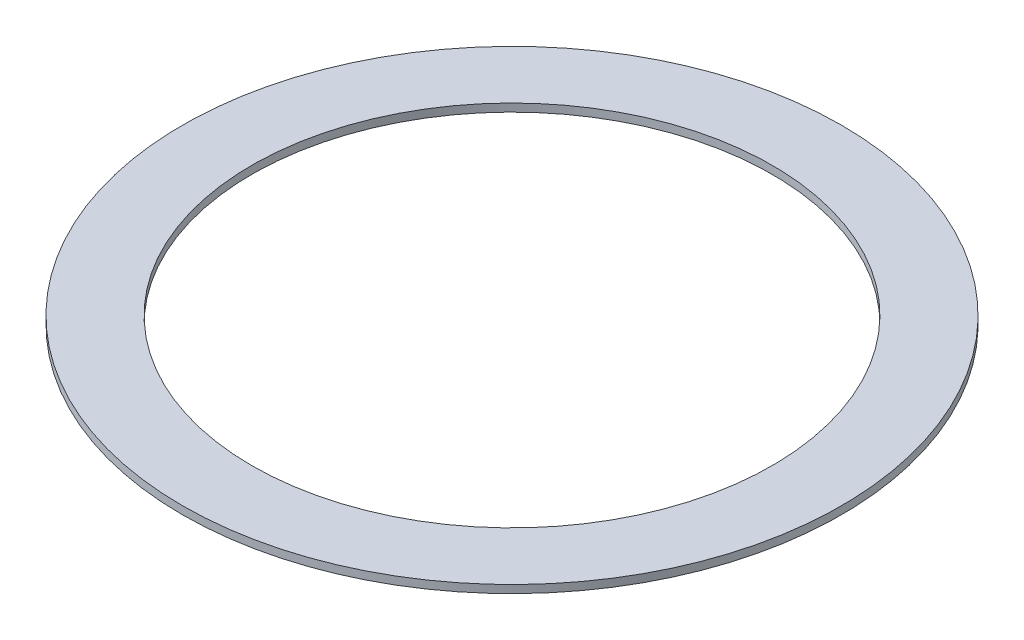
ISO-10303-21;
HEADER;
FILE_DESCRIPTION(('STEP AP214'),'2;1');
FILE_NAME('part.step','',(''),(''),'','','');
FILE_SCHEMA(('AUTOMOTIVE_DESIGN { 1 0 10303 214 1 1 1 1 }'));
ENDSEC;
DATA;
#1=APPLICATION_CONTEXT('core data for automotive mechanical design processes');
#2=APPLICATION_PROTOCOL_DEFINITION('international standard','automotive_design',2000,#1);
#3=PRODUCT_CONTEXT('',#1,'mechanical');
#4=PRODUCT('Part','Part','',(#3));
#5=PRODUCT_RELATED_PRODUCT_CATEGORY('part','',(#4));
#6=PRODUCT_DEFINITION_FORMATION('','',#4);
#7=PRODUCT_DEFINITION_CONTEXT('part definition',#1,'design');
#8=PRODUCT_DEFINITION('design','',#6,#7);
#9=PRODUCT_DEFINITION_SHAPE('','',#8);
#10=(LENGTH_UNIT() NAMED_UNIT(*) SI_UNIT(.MILLI.,.METRE.));
#11=(NAMED_UNIT(*) PLANE_ANGLE_UNIT() SI_UNIT($,.RADIAN.));
#12=(NAMED_UNIT(*) SI_UNIT($,.STERADIAN.) SOLID_ANGLE_UNIT());
#13=UNCERTAINTY_MEASURE_WITH_UNIT(LENGTH_MEASURE(1.E-05),#10,'distance_accuracy_value','');
#14=(GEOMETRIC_REPRESENTATION_CONTEXT(3) GLOBAL_UNCERTAINTY_ASSIGNED_CONTEXT((#13)) GLOBAL_UNIT_ASSIGNED_CONTEXT((#10,
#11,#12)) REPRESENTATION_CONTEXT('',''));
#15=CARTESIAN_POINT('',(0.,0.,0.));
#16=DIRECTION('',(0.,0.,1.));
#17=DIRECTION('',(1.,0.,0.));
#18=AXIS2_PLACEMENT_3D('',#15,#16,#17);
#19=CARTESIAN_POINT('',(0.,0.5,0.));
#20=DIRECTION('',(0.,1.,0.));
#21=DIRECTION('',(0.,0.,1.));
#22=AXIS2_PLACEMENT_3D('',#19,#20,#21);
#23=PLANE('',#22);
#24=CARTESIAN_POINT('',(0.,0.5,0.));
#25=DIRECTION('',(0.,1.,0.));
#26=DIRECTION('',(0.,0.,1.));
#27=AXIS2_PLACEMENT_3D('',#24,#25,#26);
#28=CIRCLE('',#27,20.9);
#29=CARTESIAN_POINT('',(0.,0.5,20.9));
#30=VERTEX_POINT('',#29);
#31=EDGE_CURVE('E10',#30,#30,#28,.T.);
#32=ORIENTED_EDGE('',*,*,#31,.T.);
#33=EDGE_LOOP('',(#32));
#34=FACE_BOUND('',#33,.T.);
#35=CARTESIAN_POINT('',(0.,0.5,0.));
#36=DIRECTION('',(0.,1.,0.));
#37=DIRECTION('',(0.,0.,1.));
#38=AXIS2_PLACEMENT_3D('',#35,#36,#37);
#39=CIRCLE('',#38,16.5);
#40=CARTESIAN_POINT('',(0.,0.5,16.5));
#41=VERTEX_POINT('',#40);
#42=EDGE_CURVE('E48',#41,#41,#39,.T.);
#43=ORIENTED_EDGE('',*,*,#42,.F.);
#44=EDGE_LOOP('',(#43));
#45=FACE_BOUND('',#44,.T.);
#46=ADVANCED_FACE('F40',(#34,#45),#23,.T.);
#47=CARTESIAN_POINT('',(0.,0.,0.));
#48=DIRECTION('',(0.,1.,0.));
#49=DIRECTION('',(0.,0.,1.));
#50=AXIS2_PLACEMENT_3D('',#47,#48,#49);
#51=PLANE('',#50);
#52=CARTESIAN_POINT('',(0.,0.,0.));
#53=DIRECTION('',(0.,1.,0.));
#54=DIRECTION('',(0.,0.,1.));
#55=AXIS2_PLACEMENT_3D('',#52,#53,#54);
#56=CIRCLE('',#55,20.9);
#57=CARTESIAN_POINT('',(0.,0.,20.9));
#58=VERTEX_POINT('',#57);
#59=EDGE_CURVE('E41',#58,#58,#56,.T.);
#60=ORIENTED_EDGE('',*,*,#59,.F.);
#61=EDGE_LOOP('',(#60));
#62=FACE_BOUND('',#61,.T.);
#63=CARTESIAN_POINT('',(0.,0.,0.));
#64=DIRECTION('',(0.,1.,0.));
#65=DIRECTION('',(0.,0.,1.));
#66=AXIS2_PLACEMENT_3D('',#63,#64,#65);
#67=CIRCLE('',#66,16.5);
#68=CARTESIAN_POINT('',(0.,0.,16.5));
#69=VERTEX_POINT('',#68);
#70=EDGE_CURVE('E49',#69,#69,#67,.T.);
#71=ORIENTED_EDGE('',*,*,#70,.T.);
#72=EDGE_LOOP('',(#71));
#73=FACE_BOUND('',#72,.T.);
#74=ADVANCED_FACE('F58',(#62,#73),#51,.F.);
#75=CARTESIAN_POINT('',(0.,0.5,0.));
#76=DIRECTION('',(0.,-1.,0.));
#77=DIRECTION('',(0.,0.,-1.));
#78=AXIS2_PLACEMENT_3D('',#75,#76,#77);
#79=CYLINDRICAL_SURFACE('',#78,20.9);
#80=ORIENTED_EDGE('',*,*,#31,.F.);
#81=EDGE_LOOP('',(#80));
#82=FACE_BOUND('',#81,.T.);
#83=ORIENTED_EDGE('',*,*,#59,.T.);
#84=EDGE_LOOP('',(#83));
#85=FACE_BOUND('',#84,.T.);
#86=ADVANCED_FACE('F39',(#82,#85),#79,.T.);
#87=CARTESIAN_POINT('',(0.,0.5,0.));
#88=DIRECTION('',(0.,-1.,0.));
#89=DIRECTION('',(0.,0.,-1.));
#90=AXIS2_PLACEMENT_3D('',#87,#88,#89);
#91=CYLINDRICAL_SURFACE('',#90,16.5);
#92=ORIENTED_EDGE('',*,*,#42,.T.);
#93=EDGE_LOOP('',(#92));
#94=FACE_BOUND('',#93,.T.);
#95=ORIENTED_EDGE('',*,*,#70,.F.);
#96=EDGE_LOOP('',(#95));
#97=FACE_BOUND('',#96,.T.);
#98=ADVANCED_FACE('F57',(#94,#97),#91,.F.);
#99=CLOSED_SHELL('',(#46,#74,#86,#98));
#100=MANIFOLD_SOLID_BREP('B2',#99);
#101=ADVANCED_BREP_SHAPE_REPRESENTATION('',(#18,#100),#14);
#102=SHAPE_DEFINITION_REPRESENTATION(#9,#101);
ENDSEC;
END-ISO-10303-21;
